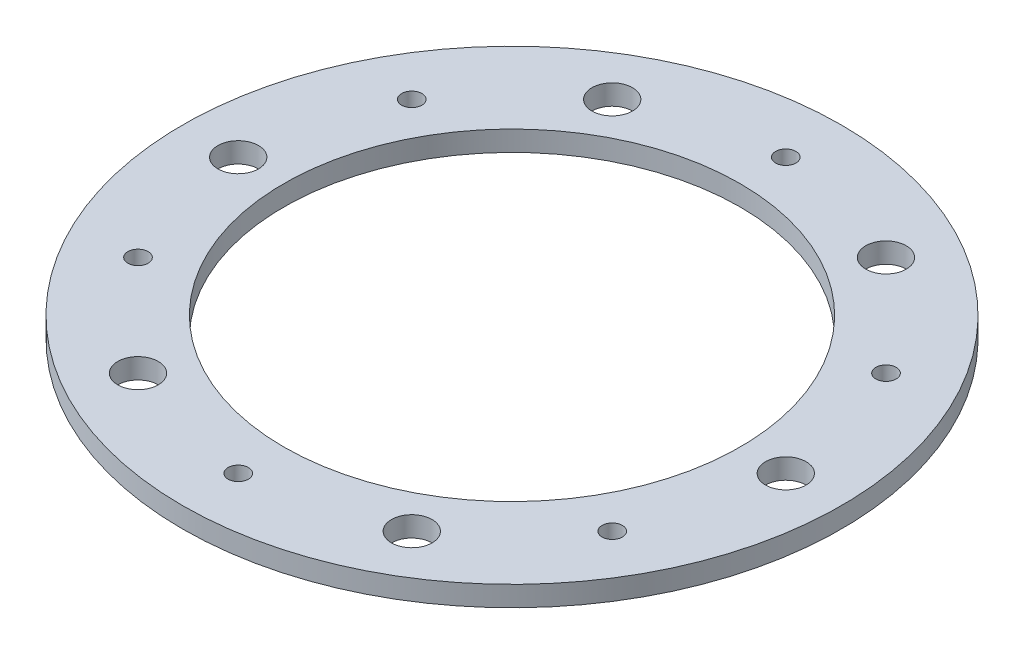
ISO-10303-21;
HEADER;
FILE_DESCRIPTION(('STEP AP214'),'2;1');
FILE_NAME('part.step','',(''),(''),'','','');
FILE_SCHEMA(('AUTOMOTIVE_DESIGN { 1 0 10303 214 1 1 1 1 }'));
ENDSEC;
DATA;
#1=APPLICATION_CONTEXT('core data for automotive mechanical design processes');
#2=APPLICATION_PROTOCOL_DEFINITION('international standard','automotive_design',2000,#1);
#3=PRODUCT_CONTEXT('',#1,'mechanical');
#4=PRODUCT('Part','Part','',(#3));
#5=PRODUCT_RELATED_PRODUCT_CATEGORY('part','',(#4));
#6=PRODUCT_DEFINITION_FORMATION('','',#4);
#7=PRODUCT_DEFINITION_CONTEXT('part definition',#1,'design');
#8=PRODUCT_DEFINITION('design','',#6,#7);
#9=PRODUCT_DEFINITION_SHAPE('','',#8);
#10=(LENGTH_UNIT() NAMED_UNIT(*) SI_UNIT(.MILLI.,.METRE.));
#11=(NAMED_UNIT(*) PLANE_ANGLE_UNIT() SI_UNIT($,.RADIAN.));
#12=(NAMED_UNIT(*) SI_UNIT($,.STERADIAN.) SOLID_ANGLE_UNIT());
#13=UNCERTAINTY_MEASURE_WITH_UNIT(LENGTH_MEASURE(1.E-05),#10,'distance_accuracy_value','');
#14=(GEOMETRIC_REPRESENTATION_CONTEXT(3) GLOBAL_UNCERTAINTY_ASSIGNED_CONTEXT((#13)) GLOBAL_UNIT_ASSIGNED_CONTEXT((#10,
#11,#12)) REPRESENTATION_CONTEXT('',''));
#15=CARTESIAN_POINT('',(0.,0.,0.));
#16=DIRECTION('',(0.,0.,1.));
#17=DIRECTION('',(1.,0.,0.));
#18=AXIS2_PLACEMENT_3D('',#15,#16,#17);
#19=CARTESIAN_POINT('',(0.,2.,0.));
#20=DIRECTION('',(0.,1.,0.));
#21=DIRECTION('',(0.,0.,1.));
#22=AXIS2_PLACEMENT_3D('',#19,#20,#21);
#23=PLANE('',#22);
#24=CARTESIAN_POINT('',(-13.4999999999999,2.,-23.3826859021799));
#25=DIRECTION('',(0.,1.,0.));
#26=DIRECTION('',(0.,0.,1.));
#27=AXIS2_PLACEMENT_3D('',#24,#25,#26);
#28=CIRCLE('',#27,2.);
#29=CARTESIAN_POINT('',(-13.4999999999999,2.,-21.3826859021799));
#30=VERTEX_POINT('',#29);
#31=EDGE_CURVE('E109',#30,#30,#28,.T.);
#32=ORIENTED_EDGE('',*,*,#31,.F.);
#33=EDGE_LOOP('',(#32));
#34=FACE_BOUND('',#33,.T.);
#35=CARTESIAN_POINT('',(13.5000000000001,2.,-23.382685902181));
#36=DIRECTION('',(0.,1.,0.));
#37=DIRECTION('',(0.,0.,1.));
#38=AXIS2_PLACEMENT_3D('',#35,#36,#37);
#39=CIRCLE('',#38,2.);
#40=CARTESIAN_POINT('',(13.5000000000001,2.,-21.382685902181));
#41=VERTEX_POINT('',#40);
#42=EDGE_CURVE('E103',#41,#41,#39,.T.);
#43=ORIENTED_EDGE('',*,*,#42,.F.);
#44=EDGE_LOOP('',(#43));
#45=FACE_BOUND('',#44,.T.);
#46=CARTESIAN_POINT('',(27.000000000001,2.,-1.65012544664584E-12));
#47=DIRECTION('',(0.,1.,0.));
#48=DIRECTION('',(0.,0.,1.));
#49=AXIS2_PLACEMENT_3D('',#46,#47,#48);
#50=CIRCLE('',#49,2.);
#51=CARTESIAN_POINT('',(27.000000000001,2.,1.99999999999835));
#52=VERTEX_POINT('',#51);
#53=EDGE_CURVE('E97',#52,#52,#50,.T.);
#54=ORIENTED_EDGE('',*,*,#53,.F.);
#55=EDGE_LOOP('',(#54));
#56=FACE_BOUND('',#55,.T.);
#57=CARTESIAN_POINT('',(13.5000000000019,2.,23.3826859021787));
#58=DIRECTION('',(0.,1.,0.));
#59=DIRECTION('',(0.,0.,1.));
#60=AXIS2_PLACEMENT_3D('',#57,#58,#59);
#61=CIRCLE('',#60,2.);
#62=CARTESIAN_POINT('',(13.5000000000019,2.,25.3826859021787));
#63=VERTEX_POINT('',#62);
#64=EDGE_CURVE('E90',#63,#63,#61,.T.);
#65=ORIENTED_EDGE('',*,*,#64,.F.);
#66=EDGE_LOOP('',(#65));
#67=FACE_BOUND('',#66,.T.);
#68=CARTESIAN_POINT('',(-13.4999999999981,2.,23.3826859021798));
#69=DIRECTION('',(0.,1.,0.));
#70=DIRECTION('',(0.,0.,1.));
#71=AXIS2_PLACEMENT_3D('',#68,#69,#70);
#72=CIRCLE('',#71,2.);
#73=CARTESIAN_POINT('',(-13.4999999999981,2.,25.3826859021798));
#74=VERTEX_POINT('',#73);
#75=EDGE_CURVE('E120',#74,#74,#72,.T.);
#76=ORIENTED_EDGE('',*,*,#75,.F.);
#77=EDGE_LOOP('',(#76));
#78=FACE_BOUND('',#77,.T.);
#79=CARTESIAN_POINT('',(-26.999999999999,2.,5.4163714549666E-13));
#80=DIRECTION('',(0.,1.,0.));
#81=DIRECTION('',(0.,0.,1.));
#82=AXIS2_PLACEMENT_3D('',#79,#80,#81);
#83=CIRCLE('',#82,2.);
#84=CARTESIAN_POINT('',(-26.999999999999,2.,2.00000000000054));
#85=VERTEX_POINT('',#84);
#86=EDGE_CURVE('E114',#85,#85,#83,.T.);
#87=ORIENTED_EDGE('',*,*,#86,.F.);
#88=EDGE_LOOP('',(#87));
#89=FACE_BOUND('',#88,.T.);
#90=CARTESIAN_POINT('',(0.,2.,0.));
#91=DIRECTION('',(0.,1.,0.));
#92=DIRECTION('',(0.,0.,1.));
#93=AXIS2_PLACEMENT_3D('',#90,#91,#92);
#94=CIRCLE('',#93,22.5);
#95=CARTESIAN_POINT('',(0.,2.,22.5));
#96=VERTEX_POINT('',#95);
#97=EDGE_CURVE('E84',#96,#96,#94,.T.);
#98=ORIENTED_EDGE('',*,*,#97,.F.);
#99=EDGE_LOOP('',(#98));
#100=FACE_BOUND('',#99,.T.);
#101=CARTESIAN_POINT('',(-23.3826859021786,2.,13.5000000000007));
#102=DIRECTION('',(0.,1.,0.));
#103=DIRECTION('',(0.,0.,1.));
#104=AXIS2_PLACEMENT_3D('',#101,#102,#103);
#105=CIRCLE('',#104,1.);
#106=CARTESIAN_POINT('',(-23.3826859021786,2.,14.5000000000007));
#107=VERTEX_POINT('',#106);
#108=EDGE_CURVE('E69',#107,#107,#105,.T.);
#109=ORIENTED_EDGE('',*,*,#108,.F.);
#110=EDGE_LOOP('',(#109));
#111=FACE_BOUND('',#110,.T.);
#112=CARTESIAN_POINT('',(23.3826859021811,2.,13.4999999999993));
#113=DIRECTION('',(0.,1.,0.));
#114=DIRECTION('',(0.,0.,1.));
#115=AXIS2_PLACEMENT_3D('',#112,#113,#114);
#116=CIRCLE('',#115,1.);
#117=CARTESIAN_POINT('',(23.3826859021811,2.,14.4999999999993));
#118=VERTEX_POINT('',#117);
#119=EDGE_CURVE('E57',#118,#118,#116,.T.);
#120=ORIENTED_EDGE('',*,*,#119,.F.);
#121=EDGE_LOOP('',(#120));
#122=FACE_BOUND('',#121,.T.);
#123=CARTESIAN_POINT('',(0.,2.,-27.));
#124=DIRECTION('',(0.,1.,0.));
#125=DIRECTION('',(0.,0.,1.));
#126=AXIS2_PLACEMENT_3D('',#123,#124,#125);
#127=CIRCLE('',#126,1.);
#128=CARTESIAN_POINT('',(0.,2.,-26.));
#129=VERTEX_POINT('',#128);
#130=EDGE_CURVE('E46',#129,#129,#127,.T.);
#131=ORIENTED_EDGE('',*,*,#130,.F.);
#132=EDGE_LOOP('',(#131));
#133=FACE_BOUND('',#132,.T.);
#134=CARTESIAN_POINT('',(0.,2.,0.));
#135=DIRECTION('',(0.,1.,0.));
#136=DIRECTION('',(0.,0.,1.));
#137=AXIS2_PLACEMENT_3D('',#134,#135,#136);
#138=CIRCLE('',#137,32.5);
#139=CARTESIAN_POINT('',(0.,2.,32.5));
#140=VERTEX_POINT('',#139);
#141=EDGE_CURVE('E10',#140,#140,#138,.T.);
#142=ORIENTED_EDGE('',*,*,#141,.T.);
#143=EDGE_LOOP('',(#142));
#144=FACE_BOUND('',#143,.T.);
#145=CARTESIAN_POINT('',(23.3826859021803,2.,-13.5000000000007));
#146=DIRECTION('',(0.,1.,0.));
#147=DIRECTION('',(0.,0.,1.));
#148=AXIS2_PLACEMENT_3D('',#145,#146,#147);
#149=CIRCLE('',#148,1.);
#150=CARTESIAN_POINT('',(23.3826859021803,2.,-12.5000000000007));
#151=VERTEX_POINT('',#150);
#152=EDGE_CURVE('E51',#151,#151,#149,.T.);
#153=ORIENTED_EDGE('',*,*,#152,.F.);
#154=EDGE_LOOP('',(#153));
#155=FACE_BOUND('',#154,.T.);
#156=CARTESIAN_POINT('',(1.69881193778876E-12,2.,27.));
#157=DIRECTION('',(0.,1.,0.));
#158=DIRECTION('',(0.,0.,1.));
#159=AXIS2_PLACEMENT_3D('',#156,#157,#158);
#160=CIRCLE('',#159,1.);
#161=CARTESIAN_POINT('',(1.69881193778876E-12,2.,28.));
#162=VERTEX_POINT('',#161);
#163=EDGE_CURVE('E63',#162,#162,#160,.T.);
#164=ORIENTED_EDGE('',*,*,#163,.F.);
#165=EDGE_LOOP('',(#164));
#166=FACE_BOUND('',#165,.T.);
#167=CARTESIAN_POINT('',(-23.3826859021794,2.,-13.4999999999992));
#168=DIRECTION('',(0.,1.,0.));
#169=DIRECTION('',(0.,0.,1.));
#170=AXIS2_PLACEMENT_3D('',#167,#168,#169);
#171=CIRCLE('',#170,1.);
#172=CARTESIAN_POINT('',(-23.3826859021794,2.,-12.4999999999992));
#173=VERTEX_POINT('',#172);
#174=EDGE_CURVE('E75',#173,#173,#171,.T.);
#175=ORIENTED_EDGE('',*,*,#174,.F.);
#176=EDGE_LOOP('',(#175));
#177=FACE_BOUND('',#176,.T.);
#178=ADVANCED_FACE('F35',(#34,#45,#56,#67,#78,#89,#100,#111,#122,#133,#144,#155,#166,#177),#23,.T.);
#179=CARTESIAN_POINT('',(0.,0.,0.));
#180=DIRECTION('',(0.,1.,0.));
#181=DIRECTION('',(0.,0.,1.));
#182=AXIS2_PLACEMENT_3D('',#179,#180,#181);
#183=PLANE('',#182);
#184=CARTESIAN_POINT('',(-13.4999999999999,0.,-23.3826859021799));
#185=DIRECTION('',(0.,1.,0.));
#186=DIRECTION('',(0.,0.,1.));
#187=AXIS2_PLACEMENT_3D('',#184,#185,#186);
#188=CIRCLE('',#187,2.);
#189=CARTESIAN_POINT('',(-13.4999999999999,0.,-21.3826859021799));
#190=VERTEX_POINT('',#189);
#191=EDGE_CURVE('E87',#190,#190,#188,.T.);
#192=ORIENTED_EDGE('',*,*,#191,.T.);
#193=EDGE_LOOP('',(#192));
#194=FACE_BOUND('',#193,.T.);
#195=CARTESIAN_POINT('',(13.5000000000001,0.,-23.382685902181));
#196=DIRECTION('',(0.,1.,0.));
#197=DIRECTION('',(0.,0.,1.));
#198=AXIS2_PLACEMENT_3D('',#195,#196,#197);
#199=CIRCLE('',#198,2.);
#200=CARTESIAN_POINT('',(13.5000000000001,0.,-21.382685902181));
#201=VERTEX_POINT('',#200);
#202=EDGE_CURVE('E106',#201,#201,#199,.T.);
#203=ORIENTED_EDGE('',*,*,#202,.T.);
#204=EDGE_LOOP('',(#203));
#205=FACE_BOUND('',#204,.T.);
#206=CARTESIAN_POINT('',(27.000000000001,0.,-1.65012544664584E-12));
#207=DIRECTION('',(0.,1.,0.));
#208=DIRECTION('',(0.,0.,1.));
#209=AXIS2_PLACEMENT_3D('',#206,#207,#208);
#210=CIRCLE('',#209,2.);
#211=CARTESIAN_POINT('',(27.000000000001,0.,1.99999999999835));
#212=VERTEX_POINT('',#211);
#213=EDGE_CURVE('E100',#212,#212,#210,.T.);
#214=ORIENTED_EDGE('',*,*,#213,.T.);
#215=EDGE_LOOP('',(#214));
#216=FACE_BOUND('',#215,.T.);
#217=CARTESIAN_POINT('',(13.5000000000019,0.,23.3826859021787));
#218=DIRECTION('',(0.,1.,0.));
#219=DIRECTION('',(0.,0.,1.));
#220=AXIS2_PLACEMENT_3D('',#217,#218,#219);
#221=CIRCLE('',#220,2.);
#222=CARTESIAN_POINT('',(13.5000000000019,0.,25.3826859021787));
#223=VERTEX_POINT('',#222);
#224=EDGE_CURVE('E93',#223,#223,#221,.T.);
#225=ORIENTED_EDGE('',*,*,#224,.T.);
#226=EDGE_LOOP('',(#225));
#227=FACE_BOUND('',#226,.T.);
#228=CARTESIAN_POINT('',(-13.4999999999981,0.,23.3826859021798));
#229=DIRECTION('',(0.,1.,0.));
#230=DIRECTION('',(0.,0.,1.));
#231=AXIS2_PLACEMENT_3D('',#228,#229,#230);
#232=CIRCLE('',#231,2.);
#233=CARTESIAN_POINT('',(-13.4999999999981,0.,25.3826859021798));
#234=VERTEX_POINT('',#233);
#235=EDGE_CURVE('E94',#234,#234,#232,.T.);
#236=ORIENTED_EDGE('',*,*,#235,.T.);
#237=EDGE_LOOP('',(#236));
#238=FACE_BOUND('',#237,.T.);
#239=CARTESIAN_POINT('',(-26.999999999999,0.,5.4163714549666E-13));
#240=DIRECTION('',(0.,1.,0.));
#241=DIRECTION('',(0.,0.,1.));
#242=AXIS2_PLACEMENT_3D('',#239,#240,#241);
#243=CIRCLE('',#242,2.);
#244=CARTESIAN_POINT('',(-26.999999999999,0.,2.00000000000054));
#245=VERTEX_POINT('',#244);
#246=EDGE_CURVE('E117',#245,#245,#243,.T.);
#247=ORIENTED_EDGE('',*,*,#246,.T.);
#248=EDGE_LOOP('',(#247));
#249=FACE_BOUND('',#248,.T.);
#250=CARTESIAN_POINT('',(0.,0.,0.));
#251=DIRECTION('',(0.,1.,0.));
#252=DIRECTION('',(0.,0.,1.));
#253=AXIS2_PLACEMENT_3D('',#250,#251,#252);
#254=CIRCLE('',#253,22.5);
#255=CARTESIAN_POINT('',(0.,0.,22.5));
#256=VERTEX_POINT('',#255);
#257=EDGE_CURVE('E81',#256,#256,#254,.T.);
#258=ORIENTED_EDGE('',*,*,#257,.T.);
#259=EDGE_LOOP('',(#258));
#260=FACE_BOUND('',#259,.T.);
#261=CARTESIAN_POINT('',(0.,0.,0.));
#262=DIRECTION('',(0.,1.,0.));
#263=DIRECTION('',(0.,0.,1.));
#264=AXIS2_PLACEMENT_3D('',#261,#262,#263);
#265=CIRCLE('',#264,32.5);
#266=CARTESIAN_POINT('',(0.,0.,32.5));
#267=VERTEX_POINT('',#266);
#268=EDGE_CURVE('E39',#267,#267,#265,.T.);
#269=ORIENTED_EDGE('',*,*,#268,.F.);
#270=EDGE_LOOP('',(#269));
#271=FACE_BOUND('',#270,.T.);
#272=CARTESIAN_POINT('',(0.,0.,-27.));
#273=DIRECTION('',(0.,1.,0.));
#274=DIRECTION('',(0.,0.,1.));
#275=AXIS2_PLACEMENT_3D('',#272,#273,#274);
#276=CIRCLE('',#275,1.);
#277=CARTESIAN_POINT('',(0.,0.,-26.));
#278=VERTEX_POINT('',#277);
#279=EDGE_CURVE('E48',#278,#278,#276,.T.);
#280=ORIENTED_EDGE('',*,*,#279,.T.);
#281=EDGE_LOOP('',(#280));
#282=FACE_BOUND('',#281,.T.);
#283=CARTESIAN_POINT('',(23.3826859021803,0.,-13.5000000000007));
#284=DIRECTION('',(0.,1.,0.));
#285=DIRECTION('',(0.,0.,1.));
#286=AXIS2_PLACEMENT_3D('',#283,#284,#285);
#287=CIRCLE('',#286,1.);
#288=CARTESIAN_POINT('',(23.3826859021803,0.,-12.5000000000007));
#289=VERTEX_POINT('',#288);
#290=EDGE_CURVE('E54',#289,#289,#287,.T.);
#291=ORIENTED_EDGE('',*,*,#290,.T.);
#292=EDGE_LOOP('',(#291));
#293=FACE_BOUND('',#292,.T.);
#294=CARTESIAN_POINT('',(23.3826859021811,0.,13.4999999999993));
#295=DIRECTION('',(0.,1.,0.));
#296=DIRECTION('',(0.,0.,1.));
#297=AXIS2_PLACEMENT_3D('',#294,#295,#296);
#298=CIRCLE('',#297,1.);
#299=CARTESIAN_POINT('',(23.3826859021811,0.,14.4999999999993));
#300=VERTEX_POINT('',#299);
#301=EDGE_CURVE('E60',#300,#300,#298,.T.);
#302=ORIENTED_EDGE('',*,*,#301,.T.);
#303=EDGE_LOOP('',(#302));
#304=FACE_BOUND('',#303,.T.);
#305=CARTESIAN_POINT('',(1.69881193778876E-12,0.,27.));
#306=DIRECTION('',(0.,1.,0.));
#307=DIRECTION('',(0.,0.,1.));
#308=AXIS2_PLACEMENT_3D('',#305,#306,#307);
#309=CIRCLE('',#308,1.);
#310=CARTESIAN_POINT('',(1.69881193778876E-12,0.,28.));
#311=VERTEX_POINT('',#310);
#312=EDGE_CURVE('E66',#311,#311,#309,.T.);
#313=ORIENTED_EDGE('',*,*,#312,.T.);
#314=EDGE_LOOP('',(#313));
#315=FACE_BOUND('',#314,.T.);
#316=CARTESIAN_POINT('',(-23.3826859021786,0.,13.5000000000007));
#317=DIRECTION('',(0.,1.,0.));
#318=DIRECTION('',(0.,0.,1.));
#319=AXIS2_PLACEMENT_3D('',#316,#317,#318);
#320=CIRCLE('',#319,1.);
#321=CARTESIAN_POINT('',(-23.3826859021786,0.,14.5000000000007));
#322=VERTEX_POINT('',#321);
#323=EDGE_CURVE('E72',#322,#322,#320,.T.);
#324=ORIENTED_EDGE('',*,*,#323,.T.);
#325=EDGE_LOOP('',(#324));
#326=FACE_BOUND('',#325,.T.);
#327=CARTESIAN_POINT('',(-23.3826859021794,0.,-13.4999999999992));
#328=DIRECTION('',(0.,1.,0.));
#329=DIRECTION('',(0.,0.,1.));
#330=AXIS2_PLACEMENT_3D('',#327,#328,#329);
#331=CIRCLE('',#330,1.);
#332=CARTESIAN_POINT('',(-23.3826859021794,0.,-12.4999999999992));
#333=VERTEX_POINT('',#332);
#334=EDGE_CURVE('E78',#333,#333,#331,.T.);
#335=ORIENTED_EDGE('',*,*,#334,.T.);
#336=EDGE_LOOP('',(#335));
#337=FACE_BOUND('',#336,.T.);
#338=ADVANCED_FACE('F126',(#194,#205,#216,#227,#238,#249,#260,#271,#282,#293,#304,#315,#326,
#337),#183,.F.);
#339=CARTESIAN_POINT('',(0.,2.,0.));
#340=DIRECTION('',(0.,-1.,0.));
#341=DIRECTION('',(0.,0.,-1.));
#342=AXIS2_PLACEMENT_3D('',#339,#340,#341);
#343=CYLINDRICAL_SURFACE('',#342,32.5);
#344=ORIENTED_EDGE('',*,*,#141,.F.);
#345=EDGE_LOOP('',(#344));
#346=FACE_BOUND('',#345,.T.);
#347=ORIENTED_EDGE('',*,*,#268,.T.);
#348=EDGE_LOOP('',(#347));
#349=FACE_BOUND('',#348,.T.);
#350=ADVANCED_FACE('F37',(#346,#349),#343,.T.);
#351=CARTESIAN_POINT('',(0.,2.,-27.));
#352=DIRECTION('',(0.,-1.,0.));
#353=DIRECTION('',(0.,0.,-1.));
#354=AXIS2_PLACEMENT_3D('',#351,#352,#353);
#355=CYLINDRICAL_SURFACE('',#354,1.);
#356=ORIENTED_EDGE('',*,*,#130,.T.);
#357=EDGE_LOOP('',(#356));
#358=FACE_BOUND('',#357,.T.);
#359=ORIENTED_EDGE('',*,*,#279,.F.);
#360=EDGE_LOOP('',(#359));
#361=FACE_BOUND('',#360,.T.);
#362=ADVANCED_FACE('F170',(#358,#361),#355,.F.);
#363=CARTESIAN_POINT('',(23.3826859021803,2.,-13.5000000000007));
#364=DIRECTION('',(0.,-1.,0.));
#365=DIRECTION('',(0.,0.,-1.));
#366=AXIS2_PLACEMENT_3D('',#363,#364,#365);
#367=CYLINDRICAL_SURFACE('',#366,1.);
#368=ORIENTED_EDGE('',*,*,#152,.T.);
#369=EDGE_LOOP('',(#368));
#370=FACE_BOUND('',#369,.T.);
#371=ORIENTED_EDGE('',*,*,#290,.F.);
#372=EDGE_LOOP('',(#371));
#373=FACE_BOUND('',#372,.T.);
#374=ADVANCED_FACE('F176',(#370,#373),#367,.F.);
#375=CARTESIAN_POINT('',(23.3826859021811,2.,13.4999999999993));
#376=DIRECTION('',(0.,-1.,0.));
#377=DIRECTION('',(0.,0.,-1.));
#378=AXIS2_PLACEMENT_3D('',#375,#376,#377);
#379=CYLINDRICAL_SURFACE('',#378,1.);
#380=ORIENTED_EDGE('',*,*,#119,.T.);
#381=EDGE_LOOP('',(#380));
#382=FACE_BOUND('',#381,.T.);
#383=ORIENTED_EDGE('',*,*,#301,.F.);
#384=EDGE_LOOP('',(#383));
#385=FACE_BOUND('',#384,.T.);
#386=ADVANCED_FACE('F180',(#382,#385),#379,.F.);
#387=CARTESIAN_POINT('',(1.69881193778876E-12,2.,27.));
#388=DIRECTION('',(0.,-1.,0.));
#389=DIRECTION('',(0.,0.,-1.));
#390=AXIS2_PLACEMENT_3D('',#387,#388,#389);
#391=CYLINDRICAL_SURFACE('',#390,1.);
#392=ORIENTED_EDGE('',*,*,#163,.T.);
#393=EDGE_LOOP('',(#392));
#394=FACE_BOUND('',#393,.T.);
#395=ORIENTED_EDGE('',*,*,#312,.F.);
#396=EDGE_LOOP('',(#395));
#397=FACE_BOUND('',#396,.T.);
#398=ADVANCED_FACE('F184',(#394,#397),#391,.F.);
#399=CARTESIAN_POINT('',(-23.3826859021786,2.,13.5000000000007));
#400=DIRECTION('',(0.,-1.,0.));
#401=DIRECTION('',(0.,0.,-1.));
#402=AXIS2_PLACEMENT_3D('',#399,#400,#401);
#403=CYLINDRICAL_SURFACE('',#402,1.);
#404=ORIENTED_EDGE('',*,*,#108,.T.);
#405=EDGE_LOOP('',(#404));
#406=FACE_BOUND('',#405,.T.);
#407=ORIENTED_EDGE('',*,*,#323,.F.);
#408=EDGE_LOOP('',(#407));
#409=FACE_BOUND('',#408,.T.);
#410=ADVANCED_FACE('F161',(#406,#409),#403,.F.);
#411=CARTESIAN_POINT('',(-23.3826859021794,2.,-13.4999999999992));
#412=DIRECTION('',(0.,-1.,0.));
#413=DIRECTION('',(0.,0.,-1.));
#414=AXIS2_PLACEMENT_3D('',#411,#412,#413);
#415=CYLINDRICAL_SURFACE('',#414,1.);
#416=ORIENTED_EDGE('',*,*,#174,.T.);
#417=EDGE_LOOP('',(#416));
#418=FACE_BOUND('',#417,.T.);
#419=ORIENTED_EDGE('',*,*,#334,.F.);
#420=EDGE_LOOP('',(#419));
#421=FACE_BOUND('',#420,.T.);
#422=ADVANCED_FACE('F157',(#418,#421),#415,.F.);
#423=CARTESIAN_POINT('',(0.,0.,0.));
#424=DIRECTION('',(0.,1.,0.));
#425=DIRECTION('',(0.,0.,1.));
#426=AXIS2_PLACEMENT_3D('',#423,#424,#425);
#427=CYLINDRICAL_SURFACE('',#426,22.5);
#428=ORIENTED_EDGE('',*,*,#257,.F.);
#429=EDGE_LOOP('',(#428));
#430=FACE_BOUND('',#429,.T.);
#431=ORIENTED_EDGE('',*,*,#97,.T.);
#432=EDGE_LOOP('',(#431));
#433=FACE_BOUND('',#432,.T.);
#434=ADVANCED_FACE('F160',(#430,#433),#427,.F.);
#435=CARTESIAN_POINT('',(-26.999999999999,0.,5.4163714549666E-13));
#436=DIRECTION('',(0.,1.,0.));
#437=DIRECTION('',(0.,0.,1.));
#438=AXIS2_PLACEMENT_3D('',#435,#436,#437);
#439=CYLINDRICAL_SURFACE('',#438,2.);
#440=ORIENTED_EDGE('',*,*,#246,.F.);
#441=EDGE_LOOP('',(#440));
#442=FACE_BOUND('',#441,.T.);
#443=ORIENTED_EDGE('',*,*,#86,.T.);
#444=EDGE_LOOP('',(#443));
#445=FACE_BOUND('',#444,.T.);
#446=ADVANCED_FACE('F133',(#442,#445),#439,.F.);
#447=CARTESIAN_POINT('',(-13.4999999999981,0.,23.3826859021798));
#448=DIRECTION('',(0.,1.,0.));
#449=DIRECTION('',(0.,0.,1.));
#450=AXIS2_PLACEMENT_3D('',#447,#448,#449);
#451=CYLINDRICAL_SURFACE('',#450,2.);
#452=ORIENTED_EDGE('',*,*,#235,.F.);
#453=EDGE_LOOP('',(#452));
#454=FACE_BOUND('',#453,.T.);
#455=ORIENTED_EDGE('',*,*,#75,.T.);
#456=EDGE_LOOP('',(#455));
#457=FACE_BOUND('',#456,.T.);
#458=ADVANCED_FACE('F129',(#454,#457),#451,.F.);
#459=CARTESIAN_POINT('',(13.5000000000019,0.,23.3826859021787));
#460=DIRECTION('',(0.,1.,0.));
#461=DIRECTION('',(0.,0.,1.));
#462=AXIS2_PLACEMENT_3D('',#459,#460,#461);
#463=CYLINDRICAL_SURFACE('',#462,2.);
#464=ORIENTED_EDGE('',*,*,#224,.F.);
#465=EDGE_LOOP('',(#464));
#466=FACE_BOUND('',#465,.T.);
#467=ORIENTED_EDGE('',*,*,#64,.T.);
#468=EDGE_LOOP('',(#467));
#469=FACE_BOUND('',#468,.T.);
#470=ADVANCED_FACE('F132',(#466,#469),#463,.F.);
#471=CARTESIAN_POINT('',(27.000000000001,0.,-1.65012544664584E-12));
#472=DIRECTION('',(0.,1.,0.));
#473=DIRECTION('',(0.,0.,1.));
#474=AXIS2_PLACEMENT_3D('',#471,#472,#473);
#475=CYLINDRICAL_SURFACE('',#474,2.);
#476=ORIENTED_EDGE('',*,*,#213,.F.);
#477=EDGE_LOOP('',(#476));
#478=FACE_BOUND('',#477,.T.);
#479=ORIENTED_EDGE('',*,*,#53,.T.);
#480=EDGE_LOOP('',(#479));
#481=FACE_BOUND('',#480,.T.);
#482=ADVANCED_FACE('F197',(#478,#481),#475,.F.);
#483=CARTESIAN_POINT('',(13.5000000000001,0.,-23.382685902181));
#484=DIRECTION('',(0.,1.,0.));
#485=DIRECTION('',(0.,0.,1.));
#486=AXIS2_PLACEMENT_3D('',#483,#484,#485);
#487=CYLINDRICAL_SURFACE('',#486,2.);
#488=ORIENTED_EDGE('',*,*,#202,.F.);
#489=EDGE_LOOP('',(#488));
#490=FACE_BOUND('',#489,.T.);
#491=ORIENTED_EDGE('',*,*,#42,.T.);
#492=EDGE_LOOP('',(#491));
#493=FACE_BOUND('',#492,.T.);
#494=ADVANCED_FACE('F201',(#490,#493),#487,.F.);
#495=CARTESIAN_POINT('',(-13.4999999999999,0.,-23.3826859021799));
#496=DIRECTION('',(0.,1.,0.));
#497=DIRECTION('',(0.,0.,1.));
#498=AXIS2_PLACEMENT_3D('',#495,#496,#497);
#499=CYLINDRICAL_SURFACE('',#498,2.);
#500=ORIENTED_EDGE('',*,*,#191,.F.);
#501=EDGE_LOOP('',(#500));
#502=FACE_BOUND('',#501,.T.);
#503=ORIENTED_EDGE('',*,*,#31,.T.);
#504=EDGE_LOOP('',(#503));
#505=FACE_BOUND('',#504,.T.);
#506=ADVANCED_FACE('F205',(#502,#505),#499,.F.);
#507=CLOSED_SHELL('',(#178,#338,#350,#362,#374,#386,#398,#410,#422,#434,#446,#458,#470,#482,
#494,#506));
#508=MANIFOLD_SOLID_BREP('B2',#507);
#509=ADVANCED_BREP_SHAPE_REPRESENTATION('',(#18,#508),#14);
#510=SHAPE_DEFINITION_REPRESENTATION(#9,#509);
ENDSEC;
END-ISO-10303-21;
